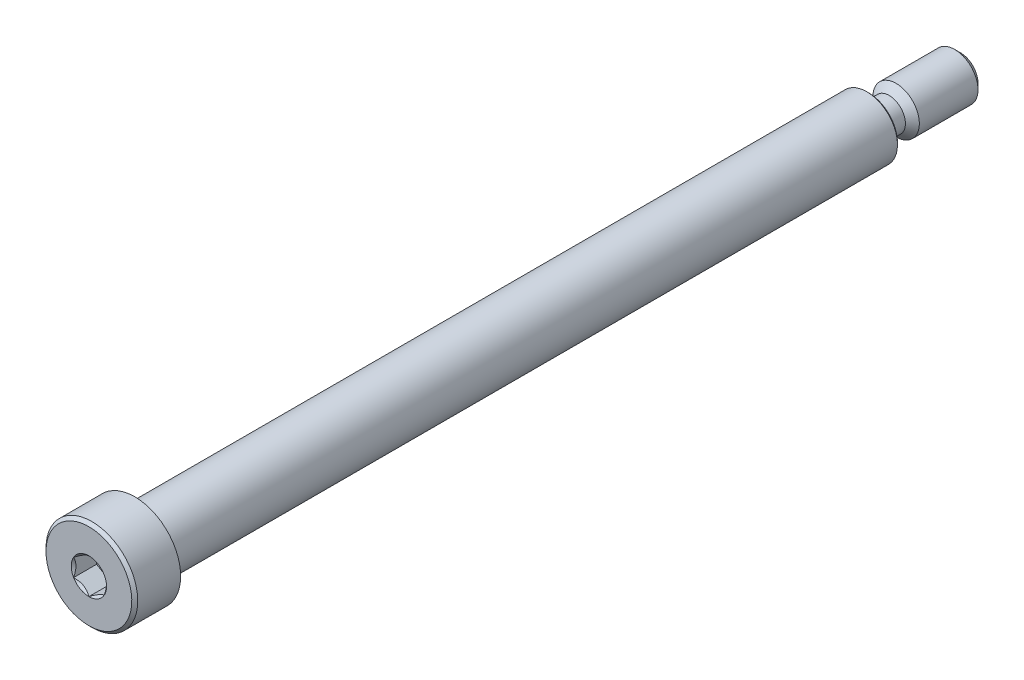
ISO-10303-21;
HEADER;
FILE_DESCRIPTION(('STEP AP214'),'2;1');
FILE_NAME('part.step','',(''),(''),'','','');
FILE_SCHEMA(('AUTOMOTIVE_DESIGN { 1 0 10303 214 1 1 1 1 }'));
ENDSEC;
DATA;
#1=APPLICATION_CONTEXT('core data for automotive mechanical design processes');
#2=APPLICATION_PROTOCOL_DEFINITION('international standard','automotive_design',2000,#1);
#3=PRODUCT_CONTEXT('',#1,'mechanical');
#4=PRODUCT('Part','Part','',(#3));
#5=PRODUCT_RELATED_PRODUCT_CATEGORY('part','',(#4));
#6=PRODUCT_DEFINITION_FORMATION('','',#4);
#7=PRODUCT_DEFINITION_CONTEXT('part definition',#1,'design');
#8=PRODUCT_DEFINITION('design','',#6,#7);
#9=PRODUCT_DEFINITION_SHAPE('','',#8);
#10=(LENGTH_UNIT() NAMED_UNIT(*) SI_UNIT(.MILLI.,.METRE.));
#11=(NAMED_UNIT(*) PLANE_ANGLE_UNIT() SI_UNIT($,.RADIAN.));
#12=(NAMED_UNIT(*) SI_UNIT($,.STERADIAN.) SOLID_ANGLE_UNIT());
#13=UNCERTAINTY_MEASURE_WITH_UNIT(LENGTH_MEASURE(1.E-05),#10,'distance_accuracy_value','');
#14=(GEOMETRIC_REPRESENTATION_CONTEXT(3) GLOBAL_UNCERTAINTY_ASSIGNED_CONTEXT((#13)) GLOBAL_UNIT_ASSIGNED_CONTEXT((#10,
#11,#12)) REPRESENTATION_CONTEXT('',''));
#15=CARTESIAN_POINT('',(0.,0.,0.));
#16=DIRECTION('',(0.,0.,1.));
#17=DIRECTION('',(1.,0.,0.));
#18=AXIS2_PLACEMENT_3D('',#15,#16,#17);
#19=CARTESIAN_POINT('',(0.,0.,0.));
#20=DIRECTION('',(0.,0.,1.));
#21=DIRECTION('',(0.,-1.,0.));
#22=AXIS2_PLACEMENT_3D('',#19,#20,#21);
#23=PLANE('',#22);
#24=CARTESIAN_POINT('',(0.,0.,0.));
#25=DIRECTION('',(0.,0.,1.));
#26=DIRECTION('',(1.,0.,0.));
#27=AXIS2_PLACEMENT_3D('',#24,#25,#26);
#28=CIRCLE('',#27,1.83308710467706);
#29=CARTESIAN_POINT('',(0.,-1.83308710467706,0.));
#30=VERTEX_POINT('',#29);
#31=CARTESIAN_POINT('',(1.58749999999999,-0.916543552338543,0.));
#32=VERTEX_POINT('',#31);
#33=EDGE_CURVE('E62',#30,#32,#28,.T.);
#34=ORIENTED_EDGE('',*,*,#33,.F.);
#35=CARTESIAN_POINT('',(-1.5875,-0.916543552338536,0.));
#36=VERTEX_POINT('',#35);
#37=EDGE_CURVE('E69',#36,#30,#28,.T.);
#38=ORIENTED_EDGE('',*,*,#37,.F.);
#39=CARTESIAN_POINT('',(-1.5875,0.916543552338528,0.));
#40=VERTEX_POINT('',#39);
#41=EDGE_CURVE('E148',#40,#36,#28,.T.);
#42=ORIENTED_EDGE('',*,*,#41,.F.);
#43=CARTESIAN_POINT('',(0.,1.83308710467706,0.));
#44=VERTEX_POINT('',#43);
#45=EDGE_CURVE('E140',#44,#40,#28,.T.);
#46=ORIENTED_EDGE('',*,*,#45,.F.);
#47=CARTESIAN_POINT('',(1.5875,0.916543552338529,0.));
#48=VERTEX_POINT('',#47);
#49=EDGE_CURVE('E111',#48,#44,#28,.T.);
#50=ORIENTED_EDGE('',*,*,#49,.F.);
#51=EDGE_CURVE('E101',#32,#48,#28,.T.);
#52=ORIENTED_EDGE('',*,*,#51,.F.);
#53=EDGE_LOOP('',(#34,#38,#42,#46,#50,#52));
#54=FACE_BOUND('',#53,.T.);
#55=CARTESIAN_POINT('',(0.,0.,0.));
#56=DIRECTION('',(0.,0.,1.));
#57=DIRECTION('',(0.,-1.,0.));
#58=AXIS2_PLACEMENT_3D('',#55,#56,#57);
#59=CIRCLE('',#58,4.45293749999997);
#60=CARTESIAN_POINT('',(0.,-4.45293749999997,0.));
#61=VERTEX_POINT('',#60);
#62=EDGE_CURVE('E234',#61,#61,#59,.T.);
#63=ORIENTED_EDGE('',*,*,#62,.T.);
#64=EDGE_LOOP('',(#63));
#65=FACE_BOUND('',#64,.T.);
#66=ADVANCED_FACE('F41',(#54,#65),#23,.T.);
#67=CARTESIAN_POINT('',(0.,0.,-90.4875));
#68=DIRECTION('',(0.,0.,-1.));
#69=DIRECTION('',(0.,1.,0.));
#70=AXIS2_PLACEMENT_3D('',#67,#68,#69);
#71=CYLINDRICAL_SURFACE('',#70,4.7625);
#72=CARTESIAN_POINT('',(0.,0.,-0.309562500000027));
#73=DIRECTION('',(0.,0.,1.));
#74=DIRECTION('',(0.,-1.,0.));
#75=AXIS2_PLACEMENT_3D('',#72,#73,#74);
#76=CIRCLE('',#75,4.7625);
#77=CARTESIAN_POINT('',(0.,-4.7625,-0.309562500000026));
#78=VERTEX_POINT('',#77);
#79=EDGE_CURVE('E237',#78,#78,#76,.F.);
#80=ORIENTED_EDGE('',*,*,#79,.T.);
#81=EDGE_LOOP('',(#80));
#82=FACE_BOUND('',#81,.T.);
#83=CARTESIAN_POINT('',(0.,0.,-4.7625));
#84=DIRECTION('',(0.,0.,-1.));
#85=DIRECTION('',(0.,1.,0.));
#86=AXIS2_PLACEMENT_3D('',#83,#84,#85);
#87=CIRCLE('',#86,4.7625);
#88=CARTESIAN_POINT('',(0.,4.7625,-4.7625));
#89=VERTEX_POINT('',#88);
#90=EDGE_CURVE('E287',#89,#89,#87,.T.);
#91=ORIENTED_EDGE('',*,*,#90,.F.);
#92=EDGE_LOOP('',(#91));
#93=FACE_BOUND('',#92,.T.);
#94=ADVANCED_FACE('F210',(#82,#93),#71,.T.);
#95=CARTESIAN_POINT('',(0.,-4.7625,-4.7625));
#96=DIRECTION('',(0.,0.,-1.));
#97=DIRECTION('',(0.,1.,0.));
#98=AXIS2_PLACEMENT_3D('',#95,#96,#97);
#99=PLANE('',#98);
#100=ORIENTED_EDGE('',*,*,#90,.T.);
#101=EDGE_LOOP('',(#100));
#102=FACE_BOUND('',#101,.T.);
#103=CARTESIAN_POINT('',(0.,0.,-4.7625));
#104=DIRECTION('',(0.,0.,-1.));
#105=DIRECTION('',(0.,1.,0.));
#106=AXIS2_PLACEMENT_3D('',#103,#104,#105);
#107=CIRCLE('',#106,3.17499999999998);
#108=CARTESIAN_POINT('',(0.,3.17499999999998,-4.7625));
#109=VERTEX_POINT('',#108);
#110=EDGE_CURVE('E277',#109,#109,#107,.T.);
#111=ORIENTED_EDGE('',*,*,#110,.F.);
#112=EDGE_LOOP('',(#111));
#113=FACE_BOUND('',#112,.T.);
#114=ADVANCED_FACE('F215',(#102,#113),#99,.T.);
#115=CARTESIAN_POINT('',(0.,0.,-90.4875));
#116=DIRECTION('',(0.,0.,-1.));
#117=DIRECTION('',(0.,1.,0.));
#118=AXIS2_PLACEMENT_3D('',#115,#116,#117);
#119=CYLINDRICAL_SURFACE('',#118,3.17499999999999);
#120=CARTESIAN_POINT('',(0.,0.,-80.7593));
#121=DIRECTION('',(0.,0.,-1.));
#122=DIRECTION('',(0.,1.,0.));
#123=AXIS2_PLACEMENT_3D('',#120,#121,#122);
#124=CIRCLE('',#123,3.17499999999999);
#125=CARTESIAN_POINT('',(0.,3.17499999999998,-80.7593));
#126=VERTEX_POINT('',#125);
#127=EDGE_CURVE('E56',#126,#126,#124,.F.);
#128=ORIENTED_EDGE('',*,*,#127,.T.);
#129=EDGE_LOOP('',(#128));
#130=FACE_BOUND('',#129,.T.);
#131=ORIENTED_EDGE('',*,*,#110,.T.);
#132=EDGE_LOOP('',(#131));
#133=FACE_BOUND('',#132,.T.);
#134=ADVANCED_FACE('F256',(#130,#133),#119,.T.);
#135=CARTESIAN_POINT('',(0.,-3.17500000000001,-80.9625));
#136=DIRECTION('',(0.,0.,-1.));
#137=DIRECTION('',(0.,1.,0.));
#138=AXIS2_PLACEMENT_3D('',#135,#136,#137);
#139=PLANE('',#138);
#140=CARTESIAN_POINT('',(0.,0.,-80.9625));
#141=DIRECTION('',(0.,0.,-1.));
#142=DIRECTION('',(0.,1.,0.));
#143=AXIS2_PLACEMENT_3D('',#140,#141,#142);
#144=CIRCLE('',#143,2.97179999999998);
#145=CARTESIAN_POINT('',(0.,2.97179999999997,-80.9625));
#146=VERTEX_POINT('',#145);
#147=EDGE_CURVE('E243',#146,#146,#144,.T.);
#148=ORIENTED_EDGE('',*,*,#147,.T.);
#149=EDGE_LOOP('',(#148));
#150=FACE_BOUND('',#149,.T.);
#151=CARTESIAN_POINT('',(0.,0.,-80.9625));
#152=DIRECTION('',(0.,0.,-1.));
#153=DIRECTION('',(0.,1.,0.));
#154=AXIS2_PLACEMENT_3D('',#151,#152,#153);
#155=CIRCLE('',#154,2.41300000000004);
#156=CARTESIAN_POINT('',(0.,2.41300000000003,-80.9625));
#157=VERTEX_POINT('',#156);
#158=EDGE_CURVE('E268',#157,#157,#155,.T.);
#159=ORIENTED_EDGE('',*,*,#158,.F.);
#160=EDGE_LOOP('',(#159));
#161=FACE_BOUND('',#160,.T.);
#162=ADVANCED_FACE('F261',(#150,#161),#139,.T.);
#163=CARTESIAN_POINT('',(0.,0.,-81.6864));
#164=DIRECTION('',(0.,0.,-1.));
#165=DIRECTION('',(0.,1.,0.));
#166=AXIS2_PLACEMENT_3D('',#163,#164,#165);
#167=TOROIDAL_SURFACE('',#166,2.41300000000004,0.723900000000048);
#168=CARTESIAN_POINT('',(0.,0.,-81.6864));
#169=DIRECTION('',(0.,0.,-1.));
#170=DIRECTION('',(0.,1.,0.));
#171=AXIS2_PLACEMENT_3D('',#168,#169,#170);
#172=CIRCLE('',#171,1.6891);
#173=CARTESIAN_POINT('',(0.,1.68909999999999,-81.6864));
#174=VERTEX_POINT('',#173);
#175=EDGE_CURVE('E272',#174,#174,#172,.T.);
#176=ORIENTED_EDGE('',*,*,#175,.F.);
#177=EDGE_LOOP('',(#176));
#178=FACE_BOUND('',#177,.T.);
#179=ORIENTED_EDGE('',*,*,#158,.T.);
#180=EDGE_LOOP('',(#179));
#181=FACE_BOUND('',#180,.T.);
#182=ADVANCED_FACE('F264',(#178,#181),#167,.F.);
#183=CARTESIAN_POINT('',(0.,0.,-90.4875));
#184=DIRECTION('',(0.,0.,-1.));
#185=DIRECTION('',(0.,1.,0.));
#186=AXIS2_PLACEMENT_3D('',#183,#184,#185);
#187=CYLINDRICAL_SURFACE('',#186,1.6891);
#188=CARTESIAN_POINT('',(0.,0.,-83.0707));
#189=DIRECTION('',(0.,0.,-1.));
#190=DIRECTION('',(0.,1.,0.));
#191=AXIS2_PLACEMENT_3D('',#188,#189,#190);
#192=CIRCLE('',#191,1.6891);
#193=CARTESIAN_POINT('',(0.,1.68909999999999,-83.0707));
#194=VERTEX_POINT('',#193);
#195=EDGE_CURVE('E280',#194,#194,#192,.T.);
#196=ORIENTED_EDGE('',*,*,#195,.F.);
#197=EDGE_LOOP('',(#196));
#198=FACE_BOUND('',#197,.T.);
#199=ORIENTED_EDGE('',*,*,#175,.T.);
#200=EDGE_LOOP('',(#199));
#201=FACE_BOUND('',#200,.T.);
#202=ADVANCED_FACE('F305',(#198,#201),#187,.T.);
#203=CARTESIAN_POINT('',(0.,0.,-83.0707));
#204=DIRECTION('',(0.,0.,-1.));
#205=DIRECTION('',(0.,1.,0.));
#206=AXIS2_PLACEMENT_3D('',#203,#204,#205);
#207=CONICAL_SURFACE('',#206,1.6891,0.785398163397444);
#208=CARTESIAN_POINT('',(0.,0.,-83.7946000000001));
#209=DIRECTION('',(0.,0.,-1.));
#210=DIRECTION('',(0.,1.,0.));
#211=AXIS2_PLACEMENT_3D('',#208,#209,#210);
#212=CIRCLE('',#211,2.41300000000004);
#213=CARTESIAN_POINT('',(0.,2.41300000000003,-83.7946000000001));
#214=VERTEX_POINT('',#213);
#215=EDGE_CURVE('E271',#214,#214,#212,.F.);
#216=ORIENTED_EDGE('',*,*,#215,.T.);
#217=EDGE_LOOP('',(#216));
#218=FACE_BOUND('',#217,.T.);
#219=ORIENTED_EDGE('',*,*,#195,.T.);
#220=EDGE_LOOP('',(#219));
#221=FACE_BOUND('',#220,.T.);
#222=ADVANCED_FACE('F297',(#218,#221),#207,.T.);
#223=CARTESIAN_POINT('',(0.,-2.41300000000006,-90.4875));
#224=DIRECTION('',(0.,0.,-1.));
#225=DIRECTION('',(0.,1.,0.));
#226=AXIS2_PLACEMENT_3D('',#223,#224,#225);
#227=PLANE('',#226);
#228=CARTESIAN_POINT('',(0.,0.,-90.4875));
#229=DIRECTION('',(0.,0.,-1.));
#230=DIRECTION('',(0.,1.,0.));
#231=AXIS2_PLACEMENT_3D('',#228,#229,#230);
#232=CIRCLE('',#231,1.80975000000008);
#233=CARTESIAN_POINT('',(0.,-1.8097500000001,-90.4875));
#234=VERTEX_POINT('',#233);
#235=EDGE_CURVE('E246',#234,#234,#232,.T.);
#236=ORIENTED_EDGE('',*,*,#235,.T.);
#237=EDGE_LOOP('',(#236));
#238=FACE_BOUND('',#237,.T.);
#239=ADVANCED_FACE('F294',(#238),#227,.T.);
#240=CARTESIAN_POINT('',(0.,0.,-90.4875));
#241=DIRECTION('',(0.,0.,-1.));
#242=DIRECTION('',(0.,1.,0.));
#243=AXIS2_PLACEMENT_3D('',#240,#241,#242);
#244=CYLINDRICAL_SURFACE('',#243,2.41300000000004);
#245=CARTESIAN_POINT('',(0.,0.,-89.88425));
#246=DIRECTION('',(0.,0.,-1.));
#247=DIRECTION('',(0.,1.,0.));
#248=AXIS2_PLACEMENT_3D('',#245,#246,#247);
#249=CIRCLE('',#248,2.41300000000004);
#250=CARTESIAN_POINT('',(0.,-2.41300000000006,-89.88425));
#251=VERTEX_POINT('',#250);
#252=EDGE_CURVE('E239',#251,#251,#249,.F.);
#253=ORIENTED_EDGE('',*,*,#252,.T.);
#254=EDGE_LOOP('',(#253));
#255=FACE_BOUND('',#254,.T.);
#256=ORIENTED_EDGE('',*,*,#215,.F.);
#257=EDGE_LOOP('',(#256));
#258=FACE_BOUND('',#257,.T.);
#259=ADVANCED_FACE('F223',(#255,#258),#244,.T.);
#260=CARTESIAN_POINT('',(0.,0.,-90.4875));
#261=DIRECTION('',(0.,0.,1.));
#262=DIRECTION('',(0.,-1.,0.));
#263=AXIS2_PLACEMENT_3D('',#260,#261,#262);
#264=CONICAL_SURFACE('',#263,1.80975000000008,0.785398163397437);
#265=CARTESIAN_POINT('',(0.,-2.41300000000006,-89.88425));
#266=CARTESIAN_POINT('',(0.,-2.40671614583339,-89.8905338541667));
#267=CARTESIAN_POINT('',(0.,-2.40043229166673,-89.8968177083333));
#268=CARTESIAN_POINT('',(0.,-2.3878645833334,-89.9093854166667));
#269=CARTESIAN_POINT('',(0.,-2.38158072916673,-89.9156692708333));
#270=CARTESIAN_POINT('',(0.,-2.3690130208334,-89.9282369791667));
#271=CARTESIAN_POINT('',(0.,-2.36272916666673,-89.9345208333333));
#272=CARTESIAN_POINT('',(0.,-2.3501614583334,-89.9470885416667));
#273=CARTESIAN_POINT('',(0.,-2.34387760416673,-89.9533723958333));
#274=CARTESIAN_POINT('',(0.,-2.3313098958334,-89.9659401041667));
#275=CARTESIAN_POINT('',(0.,-2.32502604166673,-89.9722239583333));
#276=CARTESIAN_POINT('',(0.,-2.3124583333334,-89.9847916666667));
#277=CARTESIAN_POINT('',(0.,-2.30617447916674,-89.9910755208333));
#278=CARTESIAN_POINT('',(0.,-2.2936067708334,-90.0036432291667));
#279=CARTESIAN_POINT('',(0.,-2.28732291666674,-90.0099270833333));
#280=CARTESIAN_POINT('',(0.,-2.2747552083334,-90.0224947916667));
#281=CARTESIAN_POINT('',(0.,-2.26847135416674,-90.0287786458333));
#282=CARTESIAN_POINT('',(0.,-2.25590364583341,-90.0413463541667));
#283=CARTESIAN_POINT('',(0.,-2.24961979166674,-90.0476302083333));
#284=CARTESIAN_POINT('',(0.,-2.23705208333341,-90.0601979166667));
#285=CARTESIAN_POINT('',(0.,-2.23076822916674,-90.0664817708333));
#286=CARTESIAN_POINT('',(0.,-2.21820052083341,-90.0790494791667));
#287=CARTESIAN_POINT('',(0.,-2.21191666666674,-90.0853333333333));
#288=CARTESIAN_POINT('',(0.,-2.19934895833341,-90.0979010416667));
#289=CARTESIAN_POINT('',(0.,-2.19306510416674,-90.1041848958333));
#290=CARTESIAN_POINT('',(0.,-2.18049739583341,-90.1167526041666));
#291=CARTESIAN_POINT('',(0.,-2.17421354166675,-90.1230364583333));
#292=CARTESIAN_POINT('',(0.,-2.16164583333341,-90.1356041666667));
#293=CARTESIAN_POINT('',(0.,-2.15536197916675,-90.1418880208333));
#294=CARTESIAN_POINT('',(0.,-2.14279427083341,-90.1544557291667));
#295=CARTESIAN_POINT('',(0.,-2.13651041666675,-90.1607395833333));
#296=CARTESIAN_POINT('',(0.,-2.12394270833342,-90.1733072916667));
#297=CARTESIAN_POINT('',(0.,-2.11765885416675,-90.1795911458333));
#298=CARTESIAN_POINT('',(0.,-2.10509114583342,-90.1921588541667));
#299=CARTESIAN_POINT('',(0.,-2.09880729166675,-90.1984427083333));
#300=CARTESIAN_POINT('',(0.,-2.08623958333342,-90.2110104166667));
#301=CARTESIAN_POINT('',(0.,-2.07995572916675,-90.2172942708333));
#302=CARTESIAN_POINT('',(0.,-2.06738802083342,-90.2298619791667));
#303=CARTESIAN_POINT('',(0.,-2.06110416666675,-90.2361458333333));
#304=CARTESIAN_POINT('',(0.,-2.04853645833342,-90.2487135416666));
#305=CARTESIAN_POINT('',(0.,-2.04225260416675,-90.2549973958333));
#306=CARTESIAN_POINT('',(0.,-2.02968489583342,-90.2675651041666));
#307=CARTESIAN_POINT('',(0.,-2.02340104166675,-90.2738489583333));
#308=CARTESIAN_POINT('',(0.,-2.01083333333342,-90.2864166666667));
#309=CARTESIAN_POINT('',(0.,-2.00454947916676,-90.2927005208333));
#310=CARTESIAN_POINT('',(0.,-1.99198177083343,-90.3052682291667));
#311=CARTESIAN_POINT('',(0.,-1.98569791666676,-90.3115520833333));
#312=CARTESIAN_POINT('',(0.,-1.97313020833342,-90.3241197916666));
#313=CARTESIAN_POINT('',(0.,-1.96684635416676,-90.3304036458333));
#314=CARTESIAN_POINT('',(0.,-1.95427864583343,-90.3429713541667));
#315=CARTESIAN_POINT('',(0.,-1.94799479166676,-90.3492552083333));
#316=CARTESIAN_POINT('',(0.,-1.93542708333343,-90.3618229166667));
#317=CARTESIAN_POINT('',(0.,-1.92914322916676,-90.3681067708333));
#318=CARTESIAN_POINT('',(0.,-1.91657552083343,-90.3806744791666));
#319=CARTESIAN_POINT('',(0.,-1.91029166666676,-90.3869583333333));
#320=CARTESIAN_POINT('',(0.,-1.89772395833343,-90.3995260416666));
#321=CARTESIAN_POINT('',(0.,-1.89144010416676,-90.4058098958333));
#322=CARTESIAN_POINT('',(0.,-1.87887239583343,-90.4183776041666));
#323=CARTESIAN_POINT('',(0.,-1.87258854166677,-90.4246614583333));
#324=CARTESIAN_POINT('',(0.,-1.86002083333343,-90.4372291666666));
#325=CARTESIAN_POINT('',(0.,-1.85373697916677,-90.4435130208333));
#326=CARTESIAN_POINT('',(0.,-1.84116927083343,-90.4560807291666));
#327=CARTESIAN_POINT('',(0.,-1.83488541666677,-90.4623645833333));
#328=CARTESIAN_POINT('',(0.,-1.82231770833344,-90.4749322916666));
#329=CARTESIAN_POINT('',(0.,-1.81603385416677,-90.4812161458333));
#330=CARTESIAN_POINT('',(0.,-1.8097500000001,-90.4875));
#331=B_SPLINE_CURVE_WITH_KNOTS('',3,(#265,#266,#267,#268,#269,#270,#271,#272,#273,#274,#275,
#276,#277,#278,#279,#280,#281,#282,#283,#284,#285,#286,#287,#288,#289,#290,#291,#292,#293,#294,
#295,#296,#297,#298,#299,#300,#301,#302,#303,#304,#305,#306,#307,#308,#309,#310,#311,#312,#313,
#314,#315,#316,#317,#318,#319,#320,#321,#322,#323,#324,#325,#326,#327,#328,#329,#330),
.UNSPECIFIED.,.F.,.F.,(4,2,2,2,2,2,2,2,2,2,2,2,2,2,2,2,2,2,2,2,2,2,2,2,2,2,2,2,2,2,2,2,4),(0.,
0.026660135359417,0.0533202707188438,0.0799804060782608,0.106640541437688,0.133300676797105,
0.159960812156531,0.186620947515948,0.213281082875375,0.239941218234802,0.266601353594219,
0.293261488953646,0.319921624313063,0.346581759672489,0.373241895031906,0.399902030391334,
0.42656216575076,0.453222301110177,0.479882436469604,0.506542571829021,0.533202707188448,
0.559862842547865,0.586522977907292,0.613183113266709,0.639843248626135,0.666503383985562,
0.693163519344979,0.719823654704406,0.746483790063823,0.77314392542325,0.799804060782667,
0.826464196142094,0.85312433150152),.UNSPECIFIED.);
#332=EDGE_CURVE('BSEAM220',#251,#234,#331,.T.);
#333=ORIENTED_EDGE('',*,*,#252,.F.);
#334=ORIENTED_EDGE('',*,*,#235,.F.);
#335=ORIENTED_EDGE('',*,*,#332,.T.);
#336=ORIENTED_EDGE('',*,*,#332,.F.);
#337=EDGE_LOOP('',(#333,#335,#334,#336));
#338=FACE_BOUND('',#337,.T.);
#339=ADVANCED_FACE('F220',(#338),#264,.T.);
#340=CARTESIAN_POINT('',(0.,0.,-0.309562500000027));
#341=DIRECTION('',(0.,0.,-1.));
#342=DIRECTION('',(0.,1.,0.));
#343=AXIS2_PLACEMENT_3D('',#340,#341,#342);
#344=CONICAL_SURFACE('',#343,4.7625,0.785398163397439);
#345=ORIENTED_EDGE('',*,*,#62,.F.);
#346=EDGE_LOOP('',(#345));
#347=FACE_BOUND('',#346,.T.);
#348=ORIENTED_EDGE('',*,*,#79,.F.);
#349=EDGE_LOOP('',(#348));
#350=FACE_BOUND('',#349,.T.);
#351=ADVANCED_FACE('F222',(#347,#350),#344,.T.);
#352=CARTESIAN_POINT('',(0.,0.,-80.9625));
#353=DIRECTION('',(0.,0.,1.));
#354=DIRECTION('',(0.,-1.,0.));
#355=AXIS2_PLACEMENT_3D('',#352,#353,#354);
#356=CONICAL_SURFACE('',#355,2.97179999999998,0.785398163397465);
#357=ORIENTED_EDGE('',*,*,#127,.F.);
#358=EDGE_LOOP('',(#357));
#359=FACE_BOUND('',#358,.T.);
#360=ORIENTED_EDGE('',*,*,#147,.F.);
#361=EDGE_LOOP('',(#360));
#362=FACE_BOUND('',#361,.T.);
#363=ADVANCED_FACE('F43',(#359,#362),#356,.T.);
#364=CARTESIAN_POINT('',(0.,0.,0.));
#365=DIRECTION('',(0.,0.,1.));
#366=DIRECTION('',(1.,0.,0.));
#367=AXIS2_PLACEMENT_3D('',#364,#365,#366);
#368=CONICAL_SURFACE('',#367,1.83308710467706,0.78539816339745);
#369=ORIENTED_EDGE('',*,*,#49,.T.);
#370=CARTESIAN_POINT('',(1.5877,0.916428082284689,0.000115480963707832));
#371=CARTESIAN_POINT('',(1.53312479190086,0.947937093371806,-0.0313691916294022));
#372=CARTESIAN_POINT('',(1.47763696320971,0.979973006203391,-0.0610049539864694));
#373=CARTESIAN_POINT('',(1.36449087915364,1.04529792829091,-0.115267739979174));
#374=CARTESIAN_POINT('',(1.30682185887062,1.07859315267522,-0.139864564866823));
#375=CARTESIAN_POINT('',(1.1905349781269,1.14573141457583,-0.181999635727418));
#376=CARTESIAN_POINT('',(1.13194674474407,1.17955734689075,-0.199643807270178));
#377=CARTESIAN_POINT('',(1.01348022674557,1.24795402294714,-0.226828529915031));
#378=CARTESIAN_POINT('',(0.953605562983894,1.28252267618758,-0.236389379304923));
#379=CARTESIAN_POINT('',(0.850418771876557,1.34209759781022,-0.245015586895992));
#380=CARTESIAN_POINT('',(0.807240015952287,1.36702686416637,-0.246292807190424));
#381=CARTESIAN_POINT('',(0.720953038535398,1.41684467380557,-0.244142944185296));
#382=CARTESIAN_POINT('',(0.677844847078612,1.44173319974742,-0.240714211450657));
#383=CARTESIAN_POINT('',(0.592046335002031,1.4912689937909,-0.229349005566657));
#384=CARTESIAN_POINT('',(0.549356408925406,1.51591603410293,-0.221408628198359));
#385=CARTESIAN_POINT('',(0.464693063478359,1.56479643938728,-0.201451585548899));
#386=CARTESIAN_POINT('',(0.422719959755075,1.58902962212064,-0.18943317079131));
#387=CARTESIAN_POINT('',(0.315211458113567,1.65109968448354,-0.153753102752755));
#388=CARTESIAN_POINT('',(0.250342771708901,1.68855163804125,-0.127401427696864));
#389=CARTESIAN_POINT('',(0.154961599380925,1.74361998356043,-0.082916463148299));
#390=CARTESIAN_POINT('',(0.123530699536158,1.76176662204667,-0.0672871421988697));
#391=CARTESIAN_POINT('',(0.0612469855696382,1.79772614107137,-0.0346015121389));
#392=CARTESIAN_POINT('',(0.0303939039605778,1.81553917604369,-0.0175458843430317));
#393=CARTESIAN_POINT('',(-0.00019999999999879,1.8332025747309,0.000115480963705172));
#394=B_SPLINE_CURVE_WITH_KNOTS('',3,(#370,#371,#372,#373,#374,#375,#376,#377,#378,#379,#380,
#381,#382,#383,#384,#385,#386,#387,#388,#389,#390,#391,#392,#393),.UNSPECIFIED.,.F.,.F.,(4,2,2,
2,2,2,2,2,2,2,2,4),(0.,0.211482650810817,0.424197870807277,0.633533884524816,0.84234265326335,
0.991755553727142,1.14122083674205,1.29081565918877,1.44047473906438,1.6781878086972,
1.79671410024894,1.91518409436631),.UNSPECIFIED.);
#395=EDGE_CURVE('E11',#48,#44,#394,.T.);
#396=ORIENTED_EDGE('',*,*,#395,.F.);
#397=EDGE_LOOP('',(#369,#396));
#398=FACE_BOUND('',#397,.T.);
#399=ADVANCED_FACE('F114',(#398),#368,.F.);
#400=ORIENTED_EDGE('',*,*,#45,.T.);
#401=CARTESIAN_POINT('',(0.000200000000001031,1.8332025747309,0.000115480963705317));
#402=CARTESIAN_POINT('',(-0.0543752080991352,1.80169356364378,-0.0313691916294044));
#403=CARTESIAN_POINT('',(-0.109863036790289,1.76965765081219,-0.0610049539864712));
#404=CARTESIAN_POINT('',(-0.223009120846357,1.70433272872467,-0.115267739979176));
#405=CARTESIAN_POINT('',(-0.280678141129379,1.67103750434037,-0.139864564866825));
#406=CARTESIAN_POINT('',(-0.396965021873101,1.60389924243976,-0.181999635727419));
#407=CARTESIAN_POINT('',(-0.455553255255928,1.57007331012484,-0.199643807270179));
#408=CARTESIAN_POINT('',(-0.574019773254428,1.50167663406845,-0.226828529915032));
#409=CARTESIAN_POINT('',(-0.633894437016102,1.467107980828,-0.236389379304924));
#410=CARTESIAN_POINT('',(-0.737081228123439,1.40753305920537,-0.245015586895993));
#411=CARTESIAN_POINT('',(-0.780259984047709,1.38260379284922,-0.246292807190425));
#412=CARTESIAN_POINT('',(-0.866546961464598,1.33278598321002,-0.244142944185296));
#413=CARTESIAN_POINT('',(-0.909655152921384,1.30789745726817,-0.240714211450658));
#414=CARTESIAN_POINT('',(-0.995453664997965,1.25836166322468,-0.229349005566658));
#415=CARTESIAN_POINT('',(-1.03814359107459,1.23371462291266,-0.221408628198359));
#416=CARTESIAN_POINT('',(-1.12280693652164,1.18483421762831,-0.2014515855489));
#417=CARTESIAN_POINT('',(-1.16478004024492,1.16060103489495,-0.189433170791311));
#418=CARTESIAN_POINT('',(-1.27228854188643,1.09853097253205,-0.153753102752755));
#419=CARTESIAN_POINT('',(-1.3371572282911,1.06107901897434,-0.127401427696864));
#420=CARTESIAN_POINT('',(-1.43253840061907,1.00601067345516,-0.0829164631482986));
#421=CARTESIAN_POINT('',(-1.46396930046384,0.987864034968911,-0.0672871421988691));
#422=CARTESIAN_POINT('',(-1.52625301443036,0.951904515944211,-0.034601512138899));
#423=CARTESIAN_POINT('',(-1.55710609603942,0.934091480971891,-0.0175458843430304));
#424=CARTESIAN_POINT('',(-1.5877,0.91642808228469,0.000115480963706775));
#425=B_SPLINE_CURVE_WITH_KNOTS('',3,(#401,#402,#403,#404,#405,#406,#407,#408,#409,#410,#411,
#412,#413,#414,#415,#416,#417,#418,#419,#420,#421,#422,#423,#424),.UNSPECIFIED.,.F.,.F.,(4,2,2,
2,2,2,2,2,2,2,2,4),(0.,0.211482650810816,0.424197870807274,0.633533884524813,0.842342653263345,
0.991755553727138,1.14122083674204,1.29081565918877,1.44047473906437,1.6781878086972,
1.79671410024894,1.91518409436631),.UNSPECIFIED.);
#426=EDGE_CURVE('E142',#44,#40,#425,.T.);
#427=ORIENTED_EDGE('',*,*,#426,.F.);
#428=EDGE_LOOP('',(#400,#427));
#429=FACE_BOUND('',#428,.T.);
#430=ADVANCED_FACE('F425',(#429),#368,.F.);
#431=ORIENTED_EDGE('',*,*,#41,.T.);
#432=CARTESIAN_POINT('',(-1.5875,-1.82796193726259,0.587987263053262));
#433=CARTESIAN_POINT('',(-1.5875,-1.78345227615059,0.55438665248245));
#434=CARTESIAN_POINT('',(-1.5875,-1.73869460859014,0.521115495112821));
#435=CARTESIAN_POINT('',(-1.5875,-1.64858256596373,0.455368117663873));
#436=CARTESIAN_POINT('',(-1.5875,-1.60322804392558,0.422892099235921));
#437=CARTESIAN_POINT('',(-1.5875,-1.46545441976762,0.326397611985418));
#438=CARTESIAN_POINT('',(-1.5875,-1.37200191342501,0.263830163460007));
#439=CARTESIAN_POINT('',(-1.5875,-1.17603564989745,0.141002804434972));
#440=CARTESIAN_POINT('',(-1.5875,-1.07330915468728,0.0810784496591046));
#441=CARTESIAN_POINT('',(-1.5875,-0.862725191083303,-0.0285359673271802));
#442=CARTESIAN_POINT('',(-1.5875,-0.754886591626397,-0.0782605310350632));
#443=CARTESIAN_POINT('',(-1.5875,-0.593019911814796,-0.139093925910703));
#444=CARTESIAN_POINT('',(-1.5875,-0.541388281953348,-0.156553547956909));
#445=CARTESIAN_POINT('',(-1.5875,-0.436878539644853,-0.187327632152252));
#446=CARTESIAN_POINT('',(-1.5875,-0.384000341596423,-0.200641808737995));
#447=CARTESIAN_POINT('',(-1.5875,-0.278196924179275,-0.222211694528));
#448=CARTESIAN_POINT('',(-1.5875,-0.22528965378016,-0.230554072010502));
#449=CARTESIAN_POINT('',(-1.5875,-0.118909299444438,-0.24201748229947));
#450=CARTESIAN_POINT('',(-1.5875,-0.0654363143610335,-0.245139412645061));
#451=CARTESIAN_POINT('',(-1.5875,0.0396125417767711,-0.245930358907866));
#452=CARTESIAN_POINT('',(-1.5875,0.0911870236203144,-0.243792656984369));
#453=CARTESIAN_POINT('',(-1.5875,0.193894009138673,-0.234608631517596));
#454=CARTESIAN_POINT('',(-1.5875,0.245026469388833,-0.227561831125049));
#455=CARTESIAN_POINT('',(-1.5875,0.347344844875251,-0.208824783303615));
#456=CARTESIAN_POINT('',(-1.5875,0.398516068928429,-0.197055516419633));
#457=CARTESIAN_POINT('',(-1.5875,0.49974044612459,-0.169499053465113));
#458=CARTESIAN_POINT('',(-1.5875,0.549793692439816,-0.153712193590009));
#459=CARTESIAN_POINT('',(-1.5875,0.70738077418726,-0.0980702216941557));
#460=CARTESIAN_POINT('',(-1.5875,0.812671634229884,-0.051878137425492));
#461=CARTESIAN_POINT('',(-1.5875,1.01830702558101,0.0508243359443616));
#462=CARTESIAN_POINT('',(-1.5875,1.11863208625861,0.10737179555309));
#463=CARTESIAN_POINT('',(-1.5875,1.3103677282283,0.224034193371491));
#464=CARTESIAN_POINT('',(-1.5875,1.40197355475198,0.283832216072681));
#465=CARTESIAN_POINT('',(-1.5875,1.53693633949296,0.376273802504082));
#466=CARTESIAN_POINT('',(-1.5875,1.58134147344183,0.407413627936379));
#467=CARTESIAN_POINT('',(-1.5875,1.66954488852479,0.470516819770575));
#468=CARTESIAN_POINT('',(-1.5875,1.7133433331845,0.502479957344863));
#469=CARTESIAN_POINT('',(-1.5875,1.75688919237298,0.534784489028341));
#470=B_SPLINE_CURVE_WITH_KNOTS('',3,(#432,#433,#434,#435,#436,#437,#438,#439,#440,#441,#442,
#443,#444,#445,#446,#447,#448,#449,#450,#451,#452,#453,#454,#455,#456,#457,#458,#459,#460,#461,
#462,#463,#464,#465,#466,#467,#468,#469),.UNSPECIFIED.,.F.,.F.,(4,2,2,2,2,2,2,2,2,2,2,2,2,2,2,2,
2,2,4),(0.,0.167300856006658,0.334643709885256,0.671883358358867,1.02837224619094,
1.38363464340873,1.54700775526169,1.71039211875551,1.87083807337659,2.03125644006704,
2.18586834446828,2.34049526931702,2.49782525404182,2.65514207759268,2.9990629992233,
3.34424006226482,3.67226428573993,3.83496498308973,3.99762093796192),.UNSPECIFIED.);
#471=EDGE_CURVE('E146',#40,#36,#470,.F.);
#472=ORIENTED_EDGE('',*,*,#471,.F.);
#473=EDGE_LOOP('',(#431,#472));
#474=FACE_BOUND('',#473,.T.);
#475=ADVANCED_FACE('F432',(#474),#368,.F.);
#476=ORIENTED_EDGE('',*,*,#37,.T.);
#477=CARTESIAN_POINT('',(-1.5877,-0.916428082284698,0.000115480963710651));
#478=CARTESIAN_POINT('',(-1.53312479190086,-0.947937093371814,-0.0313691916293989));
#479=CARTESIAN_POINT('',(-1.47763696320971,-0.979973006203399,-0.0610049539864657));
#480=CARTESIAN_POINT('',(-1.36449087915364,-1.04529792829092,-0.11526773997917));
#481=CARTESIAN_POINT('',(-1.30682185887062,-1.07859315267523,-0.139864564866819));
#482=CARTESIAN_POINT('',(-1.1905349781269,-1.14573141457584,-0.181999635727413));
#483=CARTESIAN_POINT('',(-1.13194674474407,-1.17955734689076,-0.199643807270173));
#484=CARTESIAN_POINT('',(-1.01348022674557,-1.24795402294715,-0.226828529915025));
#485=CARTESIAN_POINT('',(-0.953605562983896,-1.28252267618759,-0.236389379304917));
#486=CARTESIAN_POINT('',(-0.850418771876559,-1.34209759781022,-0.245015586895986));
#487=CARTESIAN_POINT('',(-0.807240015952289,-1.36702686416637,-0.246292807190418));
#488=CARTESIAN_POINT('',(-0.7209530385354,-1.41684467380557,-0.244142944185289));
#489=CARTESIAN_POINT('',(-0.677844847078613,-1.44173319974743,-0.240714211450651));
#490=CARTESIAN_POINT('',(-0.592046335002032,-1.49126899379091,-0.229349005566651));
#491=CARTESIAN_POINT('',(-0.549356408925408,-1.51591603410293,-0.221408628198353));
#492=CARTESIAN_POINT('',(-0.46469306347836,-1.56479643938728,-0.201451585548893));
#493=CARTESIAN_POINT('',(-0.422719959755076,-1.58902962212064,-0.189433170791304));
#494=CARTESIAN_POINT('',(-0.315211458113566,-1.65109968448354,-0.153753102752748));
#495=CARTESIAN_POINT('',(-0.2503427717089,-1.68855163804125,-0.127401427696857));
#496=CARTESIAN_POINT('',(-0.154961599380923,-1.74361998356043,-0.0829164631482915));
#497=CARTESIAN_POINT('',(-0.123530699536156,-1.76176662204668,-0.0672871421988619));
#498=CARTESIAN_POINT('',(-0.0612469855696354,-1.79772614107138,-0.0346015121388917));
#499=CARTESIAN_POINT('',(-0.0303939039605748,-1.8155391760437,-0.0175458843430231));
#500=CARTESIAN_POINT('',(0.000200000000002062,-1.8332025747309,0.000115480963713714));
#501=B_SPLINE_CURVE_WITH_KNOTS('',3,(#477,#478,#479,#480,#481,#482,#483,#484,#485,#486,#487,
#488,#489,#490,#491,#492,#493,#494,#495,#496,#497,#498,#499,#500),.UNSPECIFIED.,.F.,.F.,(4,2,2,
2,2,2,2,2,2,2,2,4),(0.,0.211482650810815,0.424197870807274,0.633533884524812,0.842342653263344,
0.991755553727137,1.14122083674204,1.29081565918877,1.44047473906437,1.6781878086972,
1.79671410024894,1.91518409436631),.UNSPECIFIED.);
#502=EDGE_CURVE('E174',#36,#30,#501,.T.);
#503=ORIENTED_EDGE('',*,*,#502,.F.);
#504=EDGE_LOOP('',(#476,#503));
#505=FACE_BOUND('',#504,.T.);
#506=ADVANCED_FACE('F440',(#505),#368,.F.);
#507=ORIENTED_EDGE('',*,*,#33,.T.);
#508=CARTESIAN_POINT('',(-0.000199999999997881,-1.8332025747309,0.000115480963714009));
#509=CARTESIAN_POINT('',(0.0543752080991385,-1.80169356364379,-0.0313691916293958));
#510=CARTESIAN_POINT('',(0.109863036790292,-1.7696576508122,-0.0610049539864627));
#511=CARTESIAN_POINT('',(0.223009120846361,-1.70433272872468,-0.115267739979167));
#512=CARTESIAN_POINT('',(0.280678141129383,-1.67103750434037,-0.139864564866816));
#513=CARTESIAN_POINT('',(0.396965021873105,-1.60389924243976,-0.181999635727411));
#514=CARTESIAN_POINT('',(0.455553255255933,-1.57007331012484,-0.19964380727017));
#515=CARTESIAN_POINT('',(0.574019773254433,-1.50167663406845,-0.226828529915024));
#516=CARTESIAN_POINT('',(0.633894437016107,-1.46710798082801,-0.236389379304915));
#517=CARTESIAN_POINT('',(0.737081228123444,-1.40753305920538,-0.245015586895984));
#518=CARTESIAN_POINT('',(0.780259984047714,-1.38260379284923,-0.246292807190416));
#519=CARTESIAN_POINT('',(0.866546961464604,-1.33278598321003,-0.244142944185288));
#520=CARTESIAN_POINT('',(0.90965515292139,-1.30789745726817,-0.240714211450649));
#521=CARTESIAN_POINT('',(0.995453664997972,-1.25836166322469,-0.229349005566649));
#522=CARTESIAN_POINT('',(1.0381435910746,-1.23371462291266,-0.221408628198351));
#523=CARTESIAN_POINT('',(1.12280693652164,-1.18483421762832,-0.201451585548891));
#524=CARTESIAN_POINT('',(1.16478004024493,-1.16060103489496,-0.189433170791301));
#525=CARTESIAN_POINT('',(1.27228854188644,-1.09853097253206,-0.153753102752747));
#526=CARTESIAN_POINT('',(1.3371572282911,-1.06107901897435,-0.127401427696856));
#527=CARTESIAN_POINT('',(1.43253840061908,-1.00601067345517,-0.0829164631482913));
#528=CARTESIAN_POINT('',(1.46396930046384,-0.987864034968919,-0.067287142198862));
#529=CARTESIAN_POINT('',(1.52625301443036,-0.95190451594422,-0.0346015121388923));
#530=CARTESIAN_POINT('',(1.55710609603942,-0.934091480971899,-0.017545884343024));
#531=CARTESIAN_POINT('',(1.5877,-0.916428082284699,0.000115480963712603));
#532=B_SPLINE_CURVE_WITH_KNOTS('',3,(#508,#509,#510,#511,#512,#513,#514,#515,#516,#517,#518,
#519,#520,#521,#522,#523,#524,#525,#526,#527,#528,#529,#530,#531),.UNSPECIFIED.,.F.,.F.,(4,2,2,
2,2,2,2,2,2,2,2,4),(0.,0.211482650810816,0.424197870807275,0.633533884524815,0.842342653263347,
0.991755553727141,1.14122083674205,1.29081565918877,1.44047473906438,1.6781878086972,
1.79671410024894,1.91518409436631),.UNSPECIFIED.);
#533=EDGE_CURVE('E127',#30,#32,#532,.T.);
#534=ORIENTED_EDGE('',*,*,#533,.F.);
#535=EDGE_LOOP('',(#507,#534));
#536=FACE_BOUND('',#535,.T.);
#537=ADVANCED_FACE('F167',(#536),#368,.F.);
#538=ORIENTED_EDGE('',*,*,#51,.T.);
#539=CARTESIAN_POINT('',(1.5875,-1.82796193726259,0.587987263053263));
#540=CARTESIAN_POINT('',(1.5875,-1.78345227615059,0.554386652482452));
#541=CARTESIAN_POINT('',(1.5875,-1.73869460859014,0.521115495112822));
#542=CARTESIAN_POINT('',(1.5875,-1.64858256596373,0.455368117663875));
#543=CARTESIAN_POINT('',(1.5875,-1.60322804392558,0.422892099235922));
#544=CARTESIAN_POINT('',(1.5875,-1.46545441976762,0.326397611985419));
#545=CARTESIAN_POINT('',(1.5875,-1.37200191342501,0.263830163460008));
#546=CARTESIAN_POINT('',(1.5875,-1.17603564989745,0.141002804434973));
#547=CARTESIAN_POINT('',(1.5875,-1.07330915468728,0.0810784496591058));
#548=CARTESIAN_POINT('',(1.5875,-0.862725191083303,-0.0285359673271791));
#549=CARTESIAN_POINT('',(1.5875,-0.754886591626397,-0.078260531035062));
#550=CARTESIAN_POINT('',(1.5875,-0.593019911814796,-0.139093925910701));
#551=CARTESIAN_POINT('',(1.5875,-0.541388281953348,-0.156553547956908));
#552=CARTESIAN_POINT('',(1.5875,-0.436878539644853,-0.18732763215225));
#553=CARTESIAN_POINT('',(1.5875,-0.384000341596423,-0.200641808737993));
#554=CARTESIAN_POINT('',(1.5875,-0.278196924179275,-0.222211694527998));
#555=CARTESIAN_POINT('',(1.5875,-0.225289653780159,-0.230554072010501));
#556=CARTESIAN_POINT('',(1.5875,-0.118909299444438,-0.242017482299468));
#557=CARTESIAN_POINT('',(1.5875,-0.0654363143610332,-0.245139412645059));
#558=CARTESIAN_POINT('',(1.5875,0.0396125417767714,-0.245930358907864));
#559=CARTESIAN_POINT('',(1.5875,0.0911870236203149,-0.243792656984367));
#560=CARTESIAN_POINT('',(1.5875,0.193894009138674,-0.234608631517594));
#561=CARTESIAN_POINT('',(1.5875,0.245026469388833,-0.227561831125047));
#562=CARTESIAN_POINT('',(1.5875,0.347344844875252,-0.208824783303613));
#563=CARTESIAN_POINT('',(1.5875,0.39851606892843,-0.197055516419631));
#564=CARTESIAN_POINT('',(1.5875,0.499740446124591,-0.169499053465111));
#565=CARTESIAN_POINT('',(1.5875,0.549793692439817,-0.153712193590007));
#566=CARTESIAN_POINT('',(1.5875,0.707380774187261,-0.098070221694154));
#567=CARTESIAN_POINT('',(1.5875,0.812671634229884,-0.0518781374254901));
#568=CARTESIAN_POINT('',(1.5875,1.01830702558102,0.0508243359443637));
#569=CARTESIAN_POINT('',(1.5875,1.11863208625861,0.107371795553092));
#570=CARTESIAN_POINT('',(1.5875,1.3103677282283,0.224034193371493));
#571=CARTESIAN_POINT('',(1.5875,1.40197355475198,0.283832216072683));
#572=CARTESIAN_POINT('',(1.5875,1.53693633949296,0.376273802504084));
#573=CARTESIAN_POINT('',(1.5875,1.58134147344183,0.407413627936381));
#574=CARTESIAN_POINT('',(1.5875,1.66954488852479,0.470516819770577));
#575=CARTESIAN_POINT('',(1.5875,1.7133433331845,0.502479957344865));
#576=CARTESIAN_POINT('',(1.5875,1.75688919237298,0.534784489028343));
#577=B_SPLINE_CURVE_WITH_KNOTS('',3,(#539,#540,#541,#542,#543,#544,#545,#546,#547,#548,#549,
#550,#551,#552,#553,#554,#555,#556,#557,#558,#559,#560,#561,#562,#563,#564,#565,#566,#567,#568,
#569,#570,#571,#572,#573,#574,#575,#576),.UNSPECIFIED.,.F.,.F.,(4,2,2,2,2,2,2,2,2,2,2,2,2,2,2,2,
2,2,4),(0.,0.167300856006658,0.334643709885257,0.671883358358867,1.02837224619094,
1.38363464340873,1.5470077552617,1.71039211875551,1.87083807337659,2.03125644006704,
2.18586834446828,2.34049526931702,2.49782525404183,2.65514207759269,2.9990629992233,
3.34424006226483,3.67226428573993,3.83496498308973,3.99762093796192),.UNSPECIFIED.);
#578=EDGE_CURVE('E105',#32,#48,#577,.T.);
#579=ORIENTED_EDGE('',*,*,#578,.F.);
#580=EDGE_LOOP('',(#538,#579));
#581=FACE_BOUND('',#580,.T.);
#582=ADVANCED_FACE('F103',(#581),#368,.F.);
#583=CARTESIAN_POINT('',(0.,0.,-2.38125));
#584=DIRECTION('',(0.,0.,1.));
#585=DIRECTION('',(1.,0.,0.));
#586=AXIS2_PLACEMENT_3D('',#583,#584,#585);
#587=PLANE('',#586);
#588=DIRECTION('',(0.,1.,0.));
#589=VECTOR('',#588,1.);
#590=CARTESIAN_POINT('',(1.5875,-0.916543552338537,-2.38125));
#591=LINE('',#590,#589);
#592=CARTESIAN_POINT('',(1.5875,-0.916543552338537,-2.38125));
#593=VERTEX_POINT('',#592);
#594=CARTESIAN_POINT('',(1.5875,0.916543552338527,-2.38125));
#595=VERTEX_POINT('',#594);
#596=EDGE_CURVE('E126',#593,#595,#591,.T.);
#597=ORIENTED_EDGE('',*,*,#596,.T.);
#598=DIRECTION('',(-0.866025403784439,0.5,0.));
#599=VECTOR('',#598,1.);
#600=CARTESIAN_POINT('',(1.5875,0.916543552338527,-2.38125));
#601=LINE('',#600,#599);
#602=CARTESIAN_POINT('',(0.,1.83308710467706,-2.38125));
#603=VERTEX_POINT('',#602);
#604=EDGE_CURVE('E131',#595,#603,#601,.T.);
#605=ORIENTED_EDGE('',*,*,#604,.T.);
#606=DIRECTION('',(-0.866025403784439,-0.5,0.));
#607=VECTOR('',#606,1.);
#608=CARTESIAN_POINT('',(0.,1.83308710467706,-2.38125));
#609=LINE('',#608,#607);
#610=CARTESIAN_POINT('',(-1.5875,0.916543552338528,-2.38125));
#611=VERTEX_POINT('',#610);
#612=EDGE_CURVE('E508',#603,#611,#609,.T.);
#613=ORIENTED_EDGE('',*,*,#612,.T.);
#614=DIRECTION('',(0.,-1.,0.));
#615=VECTOR('',#614,1.);
#616=CARTESIAN_POINT('',(-1.5875,0.916543552338528,-2.38125));
#617=LINE('',#616,#615);
#618=CARTESIAN_POINT('',(-1.5875,-0.916543552338536,-2.38125));
#619=VERTEX_POINT('',#618);
#620=EDGE_CURVE('E479',#611,#619,#617,.T.);
#621=ORIENTED_EDGE('',*,*,#620,.T.);
#622=DIRECTION('',(0.866025403784439,-0.5,0.));
#623=VECTOR('',#622,1.);
#624=CARTESIAN_POINT('',(-1.5875,-0.916543552338536,-2.38125));
#625=LINE('',#624,#623);
#626=CARTESIAN_POINT('',(0.,-1.83308710467707,-2.38125));
#627=VERTEX_POINT('',#626);
#628=EDGE_CURVE('E502',#619,#627,#625,.T.);
#629=ORIENTED_EDGE('',*,*,#628,.T.);
#630=DIRECTION('',(0.866025403784439,0.5,0.));
#631=VECTOR('',#630,1.);
#632=CARTESIAN_POINT('',(0.,-1.83308710467707,-2.38125));
#633=LINE('',#632,#631);
#634=EDGE_CURVE('E135',#627,#593,#633,.T.);
#635=ORIENTED_EDGE('',*,*,#634,.T.);
#636=EDGE_LOOP('',(#597,#605,#613,#621,#629,#635));
#637=FACE_BOUND('',#636,.T.);
#638=ADVANCED_FACE('F166',(#637),#587,.T.);
#639=CARTESIAN_POINT('',(1.5875,0.916543552338527,-2.38125));
#640=DIRECTION('',(0.5,0.866025403784439,0.));
#641=DIRECTION('',(-0.866025403784439,0.5,0.));
#642=AXIS2_PLACEMENT_3D('',#639,#640,#641);
#643=PLANE('',#642);
#644=DIRECTION('',(0.,0.,1.));
#645=VECTOR('',#644,1.);
#646=CARTESIAN_POINT('',(1.5875,0.916543552338527,-2.38125));
#647=LINE('',#646,#645);
#648=EDGE_CURVE('E122',#595,#48,#647,.T.);
#649=ORIENTED_EDGE('',*,*,#648,.T.);
#650=ORIENTED_EDGE('',*,*,#395,.T.);
#651=DIRECTION('',(0.,0.,1.));
#652=VECTOR('',#651,1.);
#653=CARTESIAN_POINT('',(0.,1.83308710467706,-2.38125));
#654=LINE('',#653,#652);
#655=EDGE_CURVE('E134',#603,#44,#654,.T.);
#656=ORIENTED_EDGE('',*,*,#655,.F.);
#657=ORIENTED_EDGE('',*,*,#604,.F.);
#658=EDGE_LOOP('',(#649,#650,#656,#657));
#659=FACE_BOUND('',#658,.T.);
#660=ADVANCED_FACE('F129',(#659),#643,.F.);
#661=CARTESIAN_POINT('',(0.,1.83308710467706,-2.38125));
#662=DIRECTION('',(-0.5,0.866025403784439,0.));
#663=DIRECTION('',(-0.866025403784439,-0.5,0.));
#664=AXIS2_PLACEMENT_3D('',#661,#662,#663);
#665=PLANE('',#664);
#666=ORIENTED_EDGE('',*,*,#655,.T.);
#667=ORIENTED_EDGE('',*,*,#426,.T.);
#668=DIRECTION('',(0.,0.,1.));
#669=VECTOR('',#668,1.);
#670=CARTESIAN_POINT('',(-1.5875,0.916543552338528,-2.38125));
#671=LINE('',#670,#669);
#672=EDGE_CURVE('E476',#611,#40,#671,.T.);
#673=ORIENTED_EDGE('',*,*,#672,.F.);
#674=ORIENTED_EDGE('',*,*,#612,.F.);
#675=EDGE_LOOP('',(#666,#667,#673,#674));
#676=FACE_BOUND('',#675,.T.);
#677=ADVANCED_FACE('F161',(#676),#665,.F.);
#678=CARTESIAN_POINT('',(-1.5875,0.916543552338528,-2.38125));
#679=DIRECTION('',(-1.,0.,0.));
#680=DIRECTION('',(0.,0.,1.));
#681=AXIS2_PLACEMENT_3D('',#678,#679,#680);
#682=PLANE('',#681);
#683=ORIENTED_EDGE('',*,*,#672,.T.);
#684=ORIENTED_EDGE('',*,*,#471,.T.);
#685=DIRECTION('',(0.,0.,1.));
#686=VECTOR('',#685,1.);
#687=CARTESIAN_POINT('',(-1.5875,-0.916543552338536,-2.38125));
#688=LINE('',#687,#686);
#689=EDGE_CURVE('E482',#619,#36,#688,.T.);
#690=ORIENTED_EDGE('',*,*,#689,.F.);
#691=ORIENTED_EDGE('',*,*,#620,.F.);
#692=EDGE_LOOP('',(#683,#684,#690,#691));
#693=FACE_BOUND('',#692,.T.);
#694=ADVANCED_FACE('F199',(#693),#682,.F.);
#695=CARTESIAN_POINT('',(-1.5875,-0.916543552338536,-2.38125));
#696=DIRECTION('',(-0.5,-0.866025403784439,0.));
#697=DIRECTION('',(0.866025403784439,-0.5,0.));
#698=AXIS2_PLACEMENT_3D('',#695,#696,#697);
#699=PLANE('',#698);
#700=ORIENTED_EDGE('',*,*,#689,.T.);
#701=ORIENTED_EDGE('',*,*,#502,.T.);
#702=DIRECTION('',(0.,0.,1.));
#703=VECTOR('',#702,1.);
#704=CARTESIAN_POINT('',(0.,-1.83308710467707,-2.38125));
#705=LINE('',#704,#703);
#706=EDGE_CURVE('E486',#627,#30,#705,.T.);
#707=ORIENTED_EDGE('',*,*,#706,.F.);
#708=ORIENTED_EDGE('',*,*,#628,.F.);
#709=EDGE_LOOP('',(#700,#701,#707,#708));
#710=FACE_BOUND('',#709,.T.);
#711=ADVANCED_FACE('F195',(#710),#699,.F.);
#712=CARTESIAN_POINT('',(0.,-1.83308710467707,-2.38125));
#713=DIRECTION('',(0.5,-0.866025403784439,0.));
#714=DIRECTION('',(0.866025403784439,0.5,0.));
#715=AXIS2_PLACEMENT_3D('',#712,#713,#714);
#716=PLANE('',#715);
#717=ORIENTED_EDGE('',*,*,#706,.T.);
#718=ORIENTED_EDGE('',*,*,#533,.T.);
#719=DIRECTION('',(0.,0.,1.));
#720=VECTOR('',#719,1.);
#721=CARTESIAN_POINT('',(1.5875,-0.916543552338537,-2.38125));
#722=LINE('',#721,#720);
#723=EDGE_CURVE('E124',#593,#32,#722,.T.);
#724=ORIENTED_EDGE('',*,*,#723,.F.);
#725=ORIENTED_EDGE('',*,*,#634,.F.);
#726=EDGE_LOOP('',(#717,#718,#724,#725));
#727=FACE_BOUND('',#726,.T.);
#728=ADVANCED_FACE('F192',(#727),#716,.F.);
#729=CARTESIAN_POINT('',(1.5875,-0.916543552338537,-2.38125));
#730=DIRECTION('',(1.,0.,0.));
#731=DIRECTION('',(0.,0.,-1.));
#732=AXIS2_PLACEMENT_3D('',#729,#730,#731);
#733=PLANE('',#732);
#734=ORIENTED_EDGE('',*,*,#723,.T.);
#735=ORIENTED_EDGE('',*,*,#578,.T.);
#736=ORIENTED_EDGE('',*,*,#648,.F.);
#737=ORIENTED_EDGE('',*,*,#596,.F.);
#738=EDGE_LOOP('',(#734,#735,#736,#737));
#739=FACE_BOUND('',#738,.T.);
#740=ADVANCED_FACE('F120',(#739),#733,.F.);
#741=CLOSED_SHELL('',(#66,#94,#114,#134,#162,#182,#202,#222,#239,#259,#339,#351,#363,#399,#430,
#475,#506,#537,#582,#638,#660,#677,#694,#711,#728,#740));
#742=MANIFOLD_SOLID_BREP('B2',#741);
#743=ADVANCED_BREP_SHAPE_REPRESENTATION('',(#18,#742),#14);
#744=SHAPE_DEFINITION_REPRESENTATION(#9,#743);
ENDSEC;
END-ISO-10303-21;
